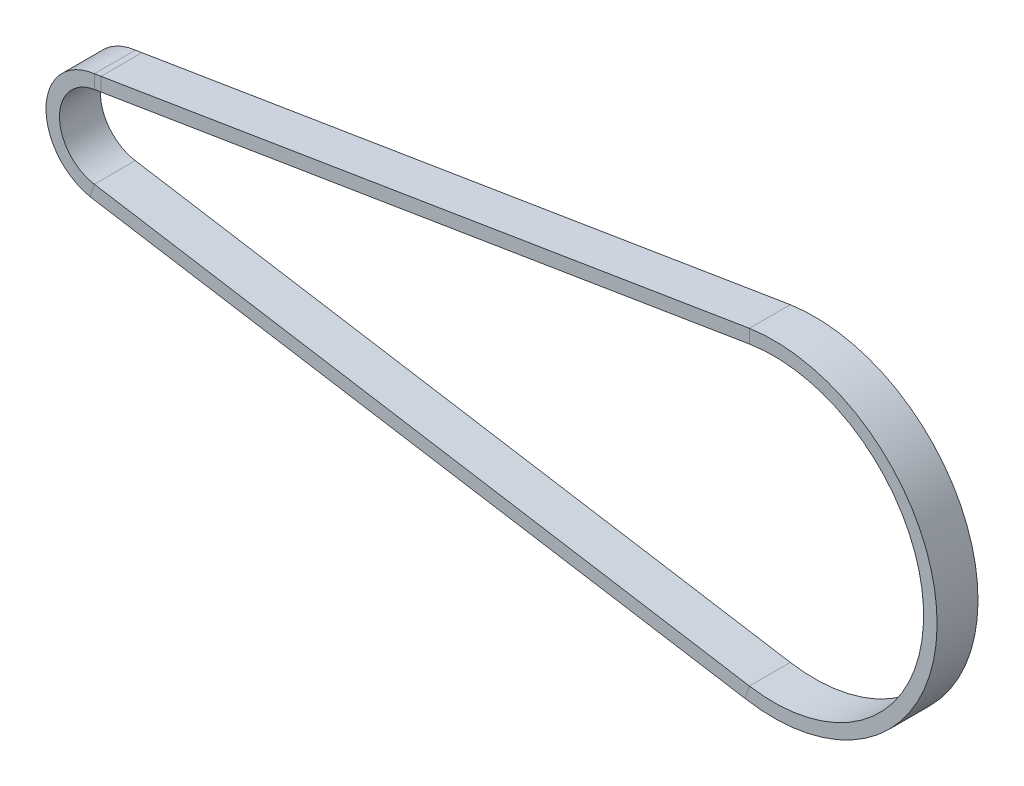
ISO-10303-21;
HEADER;
FILE_DESCRIPTION(('STEP AP214'),'2;1');
FILE_NAME('part.step','',(''),(''),'','','');
FILE_SCHEMA(('AUTOMOTIVE_DESIGN { 1 0 10303 214 1 1 1 1 }'));
ENDSEC;
DATA;
#1=APPLICATION_CONTEXT('core data for automotive mechanical design processes');
#2=APPLICATION_PROTOCOL_DEFINITION('international standard','automotive_design',2000,#1);
#3=PRODUCT_CONTEXT('',#1,'mechanical');
#4=PRODUCT('Part','Part','',(#3));
#5=PRODUCT_RELATED_PRODUCT_CATEGORY('part','',(#4));
#6=PRODUCT_DEFINITION_FORMATION('','',#4);
#7=PRODUCT_DEFINITION_CONTEXT('part definition',#1,'design');
#8=PRODUCT_DEFINITION('design','',#6,#7);
#9=PRODUCT_DEFINITION_SHAPE('','',#8);
#10=(LENGTH_UNIT() NAMED_UNIT(*) SI_UNIT(.MILLI.,.METRE.));
#11=(NAMED_UNIT(*) PLANE_ANGLE_UNIT() SI_UNIT($,.RADIAN.));
#12=(NAMED_UNIT(*) SI_UNIT($,.STERADIAN.) SOLID_ANGLE_UNIT());
#13=UNCERTAINTY_MEASURE_WITH_UNIT(LENGTH_MEASURE(1.E-05),#10,'distance_accuracy_value','');
#14=(GEOMETRIC_REPRESENTATION_CONTEXT(3) GLOBAL_UNCERTAINTY_ASSIGNED_CONTEXT((#13)) GLOBAL_UNIT_ASSIGNED_CONTEXT((#10,
#11,#12)) REPRESENTATION_CONTEXT('',''));
#15=CARTESIAN_POINT('',(0.,0.,0.));
#16=DIRECTION('',(0.,0.,1.));
#17=DIRECTION('',(1.,0.,0.));
#18=AXIS2_PLACEMENT_3D('',#15,#16,#17);
#19=CARTESIAN_POINT('',(301.78951070027,75.2855586822756,9.525));
#20=DIRECTION('',(0.,0.,-1.));
#21=DIRECTION('',(-1.,0.,0.));
#22=AXIS2_PLACEMENT_3D('',#19,#20,#21);
#23=PLANE('',#22);
#24=DIRECTION('',(0.,-1.,0.));
#25=VECTOR('',#24,1.);
#26=CARTESIAN_POINT('',(301.78951070027,75.2855586822756,9.525));
#27=LINE('',#26,#25);
#28=CARTESIAN_POINT('',(301.78951070027,75.2855586822756,9.525));
#29=VERTEX_POINT('',#28);
#30=CARTESIAN_POINT('',(301.78951070027,68.9355586822756,9.525));
#31=VERTEX_POINT('',#30);
#32=EDGE_CURVE('E167',#29,#31,#27,.T.);
#33=ORIENTED_EDGE('',*,*,#32,.F.);
#34=DIRECTION('',(-0.986908499388351,-0.161281163918893,0.));
#35=VECTOR('',#34,1.);
#36=CARTESIAN_POINT('',(301.78951070027,75.2855586822756,9.525));
#37=LINE('',#36,#35);
#38=CARTESIAN_POINT('',(0.,25.9669404168352,9.525));
#39=VERTEX_POINT('',#38);
#40=EDGE_CURVE('E166',#29,#39,#37,.T.);
#41=ORIENTED_EDGE('',*,*,#40,.T.);
#42=DIRECTION('',(0.,-1.,0.));
#43=VECTOR('',#42,1.);
#44=CARTESIAN_POINT('',(0.,25.9669404168352,9.525));
#45=LINE('',#44,#43);
#46=CARTESIAN_POINT('',(0.,19.6169404168352,9.525));
#47=VERTEX_POINT('',#46);
#48=EDGE_CURVE('E141',#39,#47,#45,.T.);
#49=ORIENTED_EDGE('',*,*,#48,.T.);
#50=DIRECTION('',(-0.986908499388351,-0.161281163918893,0.));
#51=VECTOR('',#50,1.);
#52=CARTESIAN_POINT('',(301.78951070027,68.9355586822756,9.525));
#53=LINE('',#52,#51);
#54=EDGE_CURVE('E171',#31,#47,#53,.T.);
#55=ORIENTED_EDGE('',*,*,#54,.F.);
#56=EDGE_LOOP('',(#33,#41,#49,#55));
#57=FACE_BOUND('',#56,.T.);
#58=ADVANCED_FACE('F33',(#57),#23,.F.);
#59=CARTESIAN_POINT('',(0.,25.9669404168352,9.525));
#60=DIRECTION('',(0.,0.,-1.));
#61=DIRECTION('',(-1.,0.,0.));
#62=AXIS2_PLACEMENT_3D('',#59,#60,#61);
#63=PLANE('',#62);
#64=DIRECTION('',(-0.986908499388351,-0.161281163918893,0.));
#65=VECTOR('',#64,1.);
#66=CARTESIAN_POINT('',(0.,19.6169404168352,9.525));
#67=LINE('',#66,#65);
#68=CARTESIAN_POINT('',(-3.12242353060766,19.1066721380878,9.525));
#69=VERTEX_POINT('',#68);
#70=EDGE_CURVE('E147',#47,#69,#67,.T.);
#71=ORIENTED_EDGE('',*,*,#70,.F.);
#72=ORIENTED_EDGE('',*,*,#48,.F.);
#73=DIRECTION('',(-0.986908499388351,-0.161281163918893,0.));
#74=VECTOR('',#73,1.);
#75=CARTESIAN_POINT('',(0.,25.9669404168352,9.525));
#76=LINE('',#75,#74);
#77=CARTESIAN_POINT('',(-3.12242353060766,25.4566721380878,9.525));
#78=VERTEX_POINT('',#77);
#79=EDGE_CURVE('E145',#39,#78,#76,.T.);
#80=ORIENTED_EDGE('',*,*,#79,.T.);
#81=DIRECTION('',(0.,-1.,0.));
#82=VECTOR('',#81,1.);
#83=CARTESIAN_POINT('',(-3.12242353060766,25.4566721380878,9.525));
#84=LINE('',#83,#82);
#85=EDGE_CURVE('E163',#78,#69,#84,.T.);
#86=ORIENTED_EDGE('',*,*,#85,.T.);
#87=EDGE_LOOP('',(#71,#72,#80,#86));
#88=FACE_BOUND('',#87,.T.);
#89=ADVANCED_FACE('F143',(#88),#63,.F.);
#90=CARTESIAN_POINT('',(0.,19.6169404168352,9.525));
#91=DIRECTION('',(-0.161281163918893,0.986908499388351,0.));
#92=DIRECTION('',(-0.986908499388351,-0.161281163918893,0.));
#93=AXIS2_PLACEMENT_3D('',#90,#91,#92);
#94=PLANE('',#93);
#95=DIRECTION('',(-0.986908499388351,-0.161281163918893,0.));
#96=VECTOR('',#95,1.);
#97=CARTESIAN_POINT('',(0.,19.6169404168352,-9.525));
#98=LINE('',#97,#96);
#99=CARTESIAN_POINT('',(0.,19.6169404168352,-9.525));
#100=VERTEX_POINT('',#99);
#101=CARTESIAN_POINT('',(-3.12242353060766,19.1066721380878,-9.525));
#102=VERTEX_POINT('',#101);
#103=EDGE_CURVE('E212',#100,#102,#98,.T.);
#104=ORIENTED_EDGE('',*,*,#103,.F.);
#105=DIRECTION('',(0.,0.,-1.));
#106=VECTOR('',#105,1.);
#107=CARTESIAN_POINT('',(0.,19.6169404168352,9.525));
#108=LINE('',#107,#106);
#109=EDGE_CURVE('E152',#47,#100,#108,.T.);
#110=ORIENTED_EDGE('',*,*,#109,.F.);
#111=ORIENTED_EDGE('',*,*,#70,.T.);
#112=DIRECTION('',(0.,0.,-1.));
#113=VECTOR('',#112,1.);
#114=CARTESIAN_POINT('',(-3.12242353060766,19.1066721380878,9.525));
#115=LINE('',#114,#113);
#116=EDGE_CURVE('E233',#69,#102,#115,.T.);
#117=ORIENTED_EDGE('',*,*,#116,.T.);
#118=EDGE_LOOP('',(#104,#110,#111,#117));
#119=FACE_BOUND('',#118,.T.);
#120=ADVANCED_FACE('F259',(#119),#94,.F.);
#121=CARTESIAN_POINT('',(0.,19.6169404168352,-9.525));
#122=DIRECTION('',(0.,0.,1.));
#123=DIRECTION('',(0.,-1.,0.));
#124=AXIS2_PLACEMENT_3D('',#121,#122,#123);
#125=PLANE('',#124);
#126=DIRECTION('',(-0.986908499388351,-0.161281163918893,0.));
#127=VECTOR('',#126,1.);
#128=CARTESIAN_POINT('',(0.,25.9669404168352,-9.525));
#129=LINE('',#128,#127);
#130=CARTESIAN_POINT('',(0.,25.9669404168352,-9.525));
#131=VERTEX_POINT('',#130);
#132=CARTESIAN_POINT('',(-3.12242353060766,25.4566721380878,-9.525));
#133=VERTEX_POINT('',#132);
#134=EDGE_CURVE('E182',#131,#133,#129,.T.);
#135=ORIENTED_EDGE('',*,*,#134,.F.);
#136=DIRECTION('',(0.,1.,0.));
#137=VECTOR('',#136,1.);
#138=CARTESIAN_POINT('',(0.,19.6169404168352,-9.525));
#139=LINE('',#138,#137);
#140=EDGE_CURVE('E174',#100,#131,#139,.T.);
#141=ORIENTED_EDGE('',*,*,#140,.F.);
#142=ORIENTED_EDGE('',*,*,#103,.T.);
#143=DIRECTION('',(0.,1.,0.));
#144=VECTOR('',#143,1.);
#145=CARTESIAN_POINT('',(-3.12242353060766,19.1066721380878,-9.525));
#146=LINE('',#145,#144);
#147=EDGE_CURVE('E209',#102,#133,#146,.T.);
#148=ORIENTED_EDGE('',*,*,#147,.T.);
#149=EDGE_LOOP('',(#135,#141,#142,#148));
#150=FACE_BOUND('',#149,.T.);
#151=ADVANCED_FACE('F256',(#150),#125,.F.);
#152=CARTESIAN_POINT('',(0.,25.9669404168352,-9.525));
#153=DIRECTION('',(0.161281163918893,-0.986908499388351,0.));
#154=DIRECTION('',(0.986908499388351,0.161281163918893,0.));
#155=AXIS2_PLACEMENT_3D('',#152,#153,#154);
#156=PLANE('',#155);
#157=DIRECTION('',(0.,0.,1.));
#158=VECTOR('',#157,1.);
#159=CARTESIAN_POINT('',(-3.12242353060766,25.4566721380878,-9.525));
#160=LINE('',#159,#158);
#161=EDGE_CURVE('E161',#133,#78,#160,.T.);
#162=ORIENTED_EDGE('',*,*,#161,.T.);
#163=ORIENTED_EDGE('',*,*,#79,.F.);
#164=DIRECTION('',(0.,0.,1.));
#165=VECTOR('',#164,1.);
#166=CARTESIAN_POINT('',(0.,25.9669404168352,-9.525));
#167=LINE('',#166,#165);
#168=EDGE_CURVE('E159',#131,#39,#167,.T.);
#169=ORIENTED_EDGE('',*,*,#168,.F.);
#170=ORIENTED_EDGE('',*,*,#134,.T.);
#171=EDGE_LOOP('',(#162,#163,#169,#170));
#172=FACE_BOUND('',#171,.T.);
#173=ADVANCED_FACE('F157',(#172),#156,.F.);
#174=CARTESIAN_POINT('',(-3.12242353060766,25.4566721380878,9.525));
#175=DIRECTION('',(0.,0.,-1.));
#176=DIRECTION('',(-1.,0.,0.));
#177=AXIS2_PLACEMENT_3D('',#174,#175,#176);
#178=PLANE('',#177);
#179=CARTESIAN_POINT('',(5.41233724504764E-13,3.81639164714898E-13,9.525));
#180=DIRECTION('',(0.,0.,1.));
#181=DIRECTION('',(-0.161281163918893,0.986908499388351,0.));
#182=AXIS2_PLACEMENT_3D('',#179,#180,#181);
#183=CIRCLE('',#182,19.3601252293693);
#184=CARTESIAN_POINT('',(-3.12242353060765,-19.106672138087,9.525));
#185=VERTEX_POINT('',#184);
#186=EDGE_CURVE('E126',#69,#185,#183,.T.);
#187=ORIENTED_EDGE('',*,*,#186,.F.);
#188=ORIENTED_EDGE('',*,*,#85,.F.);
#189=CARTESIAN_POINT('',(5.41233724504764E-13,3.81639164714898E-13,9.525));
#190=DIRECTION('',(0.,0.,1.));
#191=DIRECTION('',(-0.12174401532789,0.992561531962549,0.));
#192=AXIS2_PLACEMENT_3D('',#189,#190,#191);
#193=CIRCLE('',#192,25.6474498742189);
#194=CARTESIAN_POINT('',(-5.14387937418523,-25.1263246423821,9.525));
#195=VERTEX_POINT('',#194);
#196=EDGE_CURVE('E181',#78,#195,#193,.T.);
#197=ORIENTED_EDGE('',*,*,#196,.T.);
#198=DIRECTION('',(0.318339502925602,0.947976772329934,0.));
#199=VECTOR('',#198,1.);
#200=CARTESIAN_POINT('',(-5.14387937418522,-25.1263246423821,9.525));
#201=LINE('',#200,#199);
#202=EDGE_CURVE('E253',#195,#185,#201,.T.);
#203=ORIENTED_EDGE('',*,*,#202,.T.);
#204=EDGE_LOOP('',(#187,#188,#197,#203));
#205=FACE_BOUND('',#204,.T.);
#206=ADVANCED_FACE('F263',(#205),#178,.F.);
#207=CARTESIAN_POINT('',(5.41233724504764E-13,3.81639164714898E-13,0.));
#208=DIRECTION('',(0.,0.,1.));
#209=DIRECTION('',(1.,0.,0.));
#210=AXIS2_PLACEMENT_3D('',#207,#208,#209);
#211=CYLINDRICAL_SURFACE('',#210,19.3601252293693);
#212=CARTESIAN_POINT('',(5.41233724504764E-13,3.81639164714898E-13,-9.525));
#213=DIRECTION('',(0.,0.,1.));
#214=DIRECTION('',(-0.161281163918893,0.986908499388351,0.));
#215=AXIS2_PLACEMENT_3D('',#212,#213,#214);
#216=CIRCLE('',#215,19.3601252293693);
#217=CARTESIAN_POINT('',(-3.12242353060765,-19.106672138087,-9.525));
#218=VERTEX_POINT('',#217);
#219=EDGE_CURVE('E120',#102,#218,#216,.T.);
#220=ORIENTED_EDGE('',*,*,#219,.F.);
#221=ORIENTED_EDGE('',*,*,#116,.F.);
#222=ORIENTED_EDGE('',*,*,#186,.T.);
#223=DIRECTION('',(0.,0.,-1.));
#224=VECTOR('',#223,1.);
#225=CARTESIAN_POINT('',(-3.12242353060765,-19.106672138087,9.525));
#226=LINE('',#225,#224);
#227=EDGE_CURVE('E237',#185,#218,#226,.T.);
#228=ORIENTED_EDGE('',*,*,#227,.T.);
#229=EDGE_LOOP('',(#220,#221,#222,#228));
#230=FACE_BOUND('',#229,.T.);
#231=ADVANCED_FACE('F254',(#230),#211,.F.);
#232=CARTESIAN_POINT('',(-3.12242353060766,19.1066721380878,-9.525));
#233=DIRECTION('',(0.,0.,1.));
#234=DIRECTION('',(1.,0.,0.));
#235=AXIS2_PLACEMENT_3D('',#232,#233,#234);
#236=PLANE('',#235);
#237=CARTESIAN_POINT('',(5.41233724504764E-13,3.81639164714898E-13,-9.525));
#238=DIRECTION('',(0.,0.,1.));
#239=DIRECTION('',(-0.12174401532789,0.992561531962549,0.));
#240=AXIS2_PLACEMENT_3D('',#237,#238,#239);
#241=CIRCLE('',#240,25.6474498742189);
#242=CARTESIAN_POINT('',(-5.14387937418523,-25.1263246423821,-9.525));
#243=VERTEX_POINT('',#242);
#244=EDGE_CURVE('E186',#133,#243,#241,.T.);
#245=ORIENTED_EDGE('',*,*,#244,.F.);
#246=ORIENTED_EDGE('',*,*,#147,.F.);
#247=ORIENTED_EDGE('',*,*,#219,.T.);
#248=DIRECTION('',(-0.318339502925602,-0.947976772329934,0.));
#249=VECTOR('',#248,1.);
#250=CARTESIAN_POINT('',(-3.12242353060765,-19.106672138087,-9.525));
#251=LINE('',#250,#249);
#252=EDGE_CURVE('E214',#218,#243,#251,.T.);
#253=ORIENTED_EDGE('',*,*,#252,.T.);
#254=EDGE_LOOP('',(#245,#246,#247,#253));
#255=FACE_BOUND('',#254,.T.);
#256=ADVANCED_FACE('F218',(#255),#236,.F.);
#257=CARTESIAN_POINT('',(5.41233724504764E-13,3.81639164714898E-13,0.));
#258=DIRECTION('',(0.,0.,1.));
#259=DIRECTION('',(1.,0.,0.));
#260=AXIS2_PLACEMENT_3D('',#257,#258,#259);
#261=CYLINDRICAL_SURFACE('',#260,25.6474498742189);
#262=DIRECTION('',(0.,0.,1.));
#263=VECTOR('',#262,1.);
#264=CARTESIAN_POINT('',(-5.14387937418522,-25.1263246423821,-9.525));
#265=LINE('',#264,#263);
#266=EDGE_CURVE('E183',#243,#195,#265,.T.);
#267=ORIENTED_EDGE('',*,*,#266,.T.);
#268=ORIENTED_EDGE('',*,*,#196,.F.);
#269=ORIENTED_EDGE('',*,*,#161,.F.);
#270=ORIENTED_EDGE('',*,*,#244,.T.);
#271=EDGE_LOOP('',(#267,#268,#269,#270));
#272=FACE_BOUND('',#271,.T.);
#273=ADVANCED_FACE('F217',(#272),#261,.T.);
#274=CARTESIAN_POINT('',(-5.1438793741851,-25.1263246423821,9.525));
#275=DIRECTION('',(0.,0.,-1.));
#276=DIRECTION('',(-1.,0.,0.));
#277=AXIS2_PLACEMENT_3D('',#274,#275,#276);
#278=PLANE('',#277);
#279=DIRECTION('',(0.98690849938835,-0.1612811639189,0.));
#280=VECTOR('',#279,1.);
#281=CARTESIAN_POINT('',(-3.12242353060749,-19.106672138087,9.525));
#282=LINE('',#281,#280);
#283=CARTESIAN_POINT('',(301.789510700269,-68.9355586822769,9.525));
#284=VERTEX_POINT('',#283);
#285=EDGE_CURVE('E103',#185,#284,#282,.T.);
#286=ORIENTED_EDGE('',*,*,#285,.F.);
#287=ORIENTED_EDGE('',*,*,#202,.F.);
#288=DIRECTION('',(0.98690849938835,-0.1612811639189,0.));
#289=VECTOR('',#288,1.);
#290=CARTESIAN_POINT('',(-5.1438793741851,-25.1263246423821,9.525));
#291=LINE('',#290,#289);
#292=CARTESIAN_POINT('',(299.768054856692,-74.955211186572,9.525));
#293=VERTEX_POINT('',#292);
#294=EDGE_CURVE('E185',#195,#293,#291,.T.);
#295=ORIENTED_EDGE('',*,*,#294,.T.);
#296=DIRECTION('',(0.318339502925609,0.947976772329932,0.));
#297=VECTOR('',#296,1.);
#298=CARTESIAN_POINT('',(299.768054856692,-74.955211186572,9.525));
#299=LINE('',#298,#297);
#300=EDGE_CURVE('E224',#293,#284,#299,.T.);
#301=ORIENTED_EDGE('',*,*,#300,.T.);
#302=EDGE_LOOP('',(#286,#287,#295,#301));
#303=FACE_BOUND('',#302,.T.);
#304=ADVANCED_FACE('F252',(#303),#278,.F.);
#305=CARTESIAN_POINT('',(-3.12242353060749,-19.106672138087,9.525));
#306=DIRECTION('',(-0.1612811639189,-0.98690849938835,0.));
#307=DIRECTION('',(0.98690849938835,-0.1612811639189,0.));
#308=AXIS2_PLACEMENT_3D('',#305,#306,#307);
#309=PLANE('',#308);
#310=DIRECTION('',(0.98690849938835,-0.1612811639189,0.));
#311=VECTOR('',#310,1.);
#312=CARTESIAN_POINT('',(-3.12242353060749,-19.106672138087,-9.525));
#313=LINE('',#312,#311);
#314=CARTESIAN_POINT('',(301.789510700269,-68.9355586822769,-9.525));
#315=VERTEX_POINT('',#314);
#316=EDGE_CURVE('E96',#218,#315,#313,.T.);
#317=ORIENTED_EDGE('',*,*,#316,.F.);
#318=ORIENTED_EDGE('',*,*,#227,.F.);
#319=ORIENTED_EDGE('',*,*,#285,.T.);
#320=DIRECTION('',(0.,0.,-1.));
#321=VECTOR('',#320,1.);
#322=CARTESIAN_POINT('',(301.789510700269,-68.935558682277,9.525));
#323=LINE('',#322,#321);
#324=EDGE_CURVE('E240',#284,#315,#323,.T.);
#325=ORIENTED_EDGE('',*,*,#324,.T.);
#326=EDGE_LOOP('',(#317,#318,#319,#325));
#327=FACE_BOUND('',#326,.T.);
#328=ADVANCED_FACE('F242',(#327),#309,.F.);
#329=CARTESIAN_POINT('',(-3.12242353060749,-19.106672138087,-9.525));
#330=DIRECTION('',(0.,0.,1.));
#331=DIRECTION('',(0.,-1.,0.));
#332=AXIS2_PLACEMENT_3D('',#329,#330,#331);
#333=PLANE('',#332);
#334=DIRECTION('',(0.98690849938835,-0.1612811639189,0.));
#335=VECTOR('',#334,1.);
#336=CARTESIAN_POINT('',(-5.1438793741851,-25.1263246423821,-9.525));
#337=LINE('',#336,#335);
#338=CARTESIAN_POINT('',(299.768054856692,-74.955211186572,-9.525));
#339=VERTEX_POINT('',#338);
#340=EDGE_CURVE('E87',#243,#339,#337,.T.);
#341=ORIENTED_EDGE('',*,*,#340,.F.);
#342=ORIENTED_EDGE('',*,*,#252,.F.);
#343=ORIENTED_EDGE('',*,*,#316,.T.);
#344=DIRECTION('',(-0.318339502925609,-0.947976772329932,0.));
#345=VECTOR('',#344,1.);
#346=CARTESIAN_POINT('',(301.789510700269,-68.935558682277,-9.525));
#347=LINE('',#346,#345);
#348=EDGE_CURVE('E193',#315,#339,#347,.T.);
#349=ORIENTED_EDGE('',*,*,#348,.T.);
#350=EDGE_LOOP('',(#341,#342,#343,#349));
#351=FACE_BOUND('',#350,.T.);
#352=ADVANCED_FACE('F219',(#351),#333,.F.);
#353=CARTESIAN_POINT('',(-5.1438793741851,-25.1263246423821,-9.525));
#354=DIRECTION('',(0.1612811639189,0.98690849938835,0.));
#355=DIRECTION('',(-0.98690849938835,0.1612811639189,0.));
#356=AXIS2_PLACEMENT_3D('',#353,#354,#355);
#357=PLANE('',#356);
#358=DIRECTION('',(0.,0.,1.));
#359=VECTOR('',#358,1.);
#360=CARTESIAN_POINT('',(299.768054856692,-74.955211186572,-9.525));
#361=LINE('',#360,#359);
#362=EDGE_CURVE('E187',#339,#293,#361,.T.);
#363=ORIENTED_EDGE('',*,*,#362,.T.);
#364=ORIENTED_EDGE('',*,*,#294,.F.);
#365=ORIENTED_EDGE('',*,*,#266,.F.);
#366=ORIENTED_EDGE('',*,*,#340,.T.);
#367=EDGE_LOOP('',(#363,#364,#365,#366));
#368=FACE_BOUND('',#367,.T.);
#369=ADVANCED_FACE('F220',(#368),#357,.F.);
#370=CARTESIAN_POINT('',(299.768054856692,-74.955211186572,9.525));
#371=DIRECTION('',(0.,0.,-1.));
#372=DIRECTION('',(-1.,0.,0.));
#373=AXIS2_PLACEMENT_3D('',#370,#371,#372);
#374=PLANE('',#373);
#375=CARTESIAN_POINT('',(313.055000000004,-7.21644966006352E-13,9.525));
#376=DIRECTION('',(0.,0.,1.));
#377=DIRECTION('',(-0.1612811639189,-0.98690849938835,0.));
#378=AXIS2_PLACEMENT_3D('',#375,#376,#377);
#379=CIRCLE('',#378,69.85);
#380=EDGE_CURVE('E191',#284,#31,#379,.T.);
#381=ORIENTED_EDGE('',*,*,#380,.F.);
#382=ORIENTED_EDGE('',*,*,#300,.F.);
#383=CARTESIAN_POINT('',(313.055000000004,-7.21644966006352E-13,9.525));
#384=DIRECTION('',(0.,0.,1.));
#385=DIRECTION('',(-0.17454399808837,-0.984649375529852,0.));
#386=AXIS2_PLACEMENT_3D('',#383,#384,#385);
#387=CIRCLE('',#386,76.1237584152603);
#388=EDGE_CURVE('E188',#293,#29,#387,.T.);
#389=ORIENTED_EDGE('',*,*,#388,.T.);
#390=ORIENTED_EDGE('',*,*,#32,.T.);
#391=EDGE_LOOP('',(#381,#382,#389,#390));
#392=FACE_BOUND('',#391,.T.);
#393=ADVANCED_FACE('F251',(#392),#374,.F.);
#394=CARTESIAN_POINT('',(313.055000000004,-7.21644966006352E-13,0.));
#395=DIRECTION('',(0.,0.,1.));
#396=DIRECTION('',(1.,0.,0.));
#397=AXIS2_PLACEMENT_3D('',#394,#395,#396);
#398=CYLINDRICAL_SURFACE('',#397,69.85);
#399=CARTESIAN_POINT('',(313.055000000004,-7.21644966006352E-13,-9.525));
#400=DIRECTION('',(0.,0.,1.));
#401=DIRECTION('',(-0.1612811639189,-0.98690849938835,0.));
#402=AXIS2_PLACEMENT_3D('',#399,#400,#401);
#403=CIRCLE('',#402,69.85);
#404=CARTESIAN_POINT('',(301.78951070027,68.9355586822756,-9.525));
#405=VERTEX_POINT('',#404);
#406=EDGE_CURVE('E58',#315,#405,#403,.T.);
#407=ORIENTED_EDGE('',*,*,#406,.F.);
#408=ORIENTED_EDGE('',*,*,#324,.F.);
#409=ORIENTED_EDGE('',*,*,#380,.T.);
#410=DIRECTION('',(0.,0.,-1.));
#411=VECTOR('',#410,1.);
#412=CARTESIAN_POINT('',(301.78951070027,68.9355586822756,9.525));
#413=LINE('',#412,#411);
#414=EDGE_CURVE('E199',#31,#405,#413,.T.);
#415=ORIENTED_EDGE('',*,*,#414,.T.);
#416=EDGE_LOOP('',(#407,#408,#409,#415));
#417=FACE_BOUND('',#416,.T.);
#418=ADVANCED_FACE('F244',(#417),#398,.F.);
#419=CARTESIAN_POINT('',(301.789510700269,-68.935558682277,-9.525));
#420=DIRECTION('',(0.,0.,1.));
#421=DIRECTION('',(1.,0.,0.));
#422=AXIS2_PLACEMENT_3D('',#419,#420,#421);
#423=PLANE('',#422);
#424=CARTESIAN_POINT('',(313.055000000004,-7.21644966006352E-13,-9.525));
#425=DIRECTION('',(0.,0.,1.));
#426=DIRECTION('',(-0.17454399808837,-0.984649375529852,0.));
#427=AXIS2_PLACEMENT_3D('',#424,#425,#426);
#428=CIRCLE('',#427,76.1237584152603);
#429=CARTESIAN_POINT('',(301.78951070027,75.2855586822756,-9.525));
#430=VERTEX_POINT('',#429);
#431=EDGE_CURVE('E50',#339,#430,#428,.T.);
#432=ORIENTED_EDGE('',*,*,#431,.F.);
#433=ORIENTED_EDGE('',*,*,#348,.F.);
#434=ORIENTED_EDGE('',*,*,#406,.T.);
#435=DIRECTION('',(0.,1.,0.));
#436=VECTOR('',#435,1.);
#437=CARTESIAN_POINT('',(301.78951070027,68.9355586822756,-9.525));
#438=LINE('',#437,#436);
#439=EDGE_CURVE('E198',#405,#430,#438,.T.);
#440=ORIENTED_EDGE('',*,*,#439,.T.);
#441=EDGE_LOOP('',(#432,#433,#434,#440));
#442=FACE_BOUND('',#441,.T.);
#443=ADVANCED_FACE('F247',(#442),#423,.F.);
#444=CARTESIAN_POINT('',(313.055000000004,-7.21644966006352E-13,0.));
#445=DIRECTION('',(0.,0.,1.));
#446=DIRECTION('',(1.,0.,0.));
#447=AXIS2_PLACEMENT_3D('',#444,#445,#446);
#448=CYLINDRICAL_SURFACE('',#447,76.1237584152603);
#449=DIRECTION('',(0.,0.,1.));
#450=VECTOR('',#449,1.);
#451=CARTESIAN_POINT('',(301.78951070027,75.2855586822756,-9.525));
#452=LINE('',#451,#450);
#453=EDGE_CURVE('E37',#430,#29,#452,.T.);
#454=ORIENTED_EDGE('',*,*,#453,.T.);
#455=ORIENTED_EDGE('',*,*,#388,.F.);
#456=ORIENTED_EDGE('',*,*,#362,.F.);
#457=ORIENTED_EDGE('',*,*,#431,.T.);
#458=EDGE_LOOP('',(#454,#455,#456,#457));
#459=FACE_BOUND('',#458,.T.);
#460=ADVANCED_FACE('F248',(#459),#448,.T.);
#461=CARTESIAN_POINT('',(301.78951070027,68.9355586822756,9.525));
#462=DIRECTION('',(-0.161281163918893,0.986908499388351,0.));
#463=DIRECTION('',(-0.986908499388351,-0.161281163918893,0.));
#464=AXIS2_PLACEMENT_3D('',#461,#462,#463);
#465=PLANE('',#464);
#466=ORIENTED_EDGE('',*,*,#54,.T.);
#467=ORIENTED_EDGE('',*,*,#109,.T.);
#468=DIRECTION('',(-0.986908499388351,-0.161281163918893,0.));
#469=VECTOR('',#468,1.);
#470=CARTESIAN_POINT('',(301.78951070027,68.9355586822756,-9.525));
#471=LINE('',#470,#469);
#472=EDGE_CURVE('E42',#405,#100,#471,.T.);
#473=ORIENTED_EDGE('',*,*,#472,.F.);
#474=ORIENTED_EDGE('',*,*,#414,.F.);
#475=EDGE_LOOP('',(#466,#467,#473,#474));
#476=FACE_BOUND('',#475,.T.);
#477=ADVANCED_FACE('F290',(#476),#465,.F.);
#478=CARTESIAN_POINT('',(301.78951070027,68.9355586822756,-9.525));
#479=DIRECTION('',(0.,0.,1.));
#480=DIRECTION('',(0.,-1.,0.));
#481=AXIS2_PLACEMENT_3D('',#478,#479,#480);
#482=PLANE('',#481);
#483=ORIENTED_EDGE('',*,*,#472,.T.);
#484=ORIENTED_EDGE('',*,*,#140,.T.);
#485=DIRECTION('',(-0.986908499388351,-0.161281163918893,0.));
#486=VECTOR('',#485,1.);
#487=CARTESIAN_POINT('',(301.78951070027,75.2855586822756,-9.525));
#488=LINE('',#487,#486);
#489=EDGE_CURVE('E11',#430,#131,#488,.T.);
#490=ORIENTED_EDGE('',*,*,#489,.F.);
#491=ORIENTED_EDGE('',*,*,#439,.F.);
#492=EDGE_LOOP('',(#483,#484,#490,#491));
#493=FACE_BOUND('',#492,.T.);
#494=ADVANCED_FACE('F293',(#493),#482,.F.);
#495=CARTESIAN_POINT('',(301.78951070027,75.2855586822756,-9.525));
#496=DIRECTION('',(0.161281163918893,-0.986908499388351,0.));
#497=DIRECTION('',(0.986908499388351,0.161281163918893,0.));
#498=AXIS2_PLACEMENT_3D('',#495,#496,#497);
#499=PLANE('',#498);
#500=ORIENTED_EDGE('',*,*,#489,.T.);
#501=ORIENTED_EDGE('',*,*,#168,.T.);
#502=ORIENTED_EDGE('',*,*,#40,.F.);
#503=ORIENTED_EDGE('',*,*,#453,.F.);
#504=EDGE_LOOP('',(#500,#501,#502,#503));
#505=FACE_BOUND('',#504,.T.);
#506=ADVANCED_FACE('F35',(#505),#499,.F.);
#507=CLOSED_SHELL('',(#58,#89,#120,#151,#173,#206,#231,#256,#273,#304,#328,#352,#369,#393,#418,
#443,#460,#477,#494,#506));
#508=MANIFOLD_SOLID_BREP('B2',#507);
#509=ADVANCED_BREP_SHAPE_REPRESENTATION('',(#18,#508),#14);
#510=SHAPE_DEFINITION_REPRESENTATION(#9,#509);
ENDSEC;
END-ISO-10303-21;
